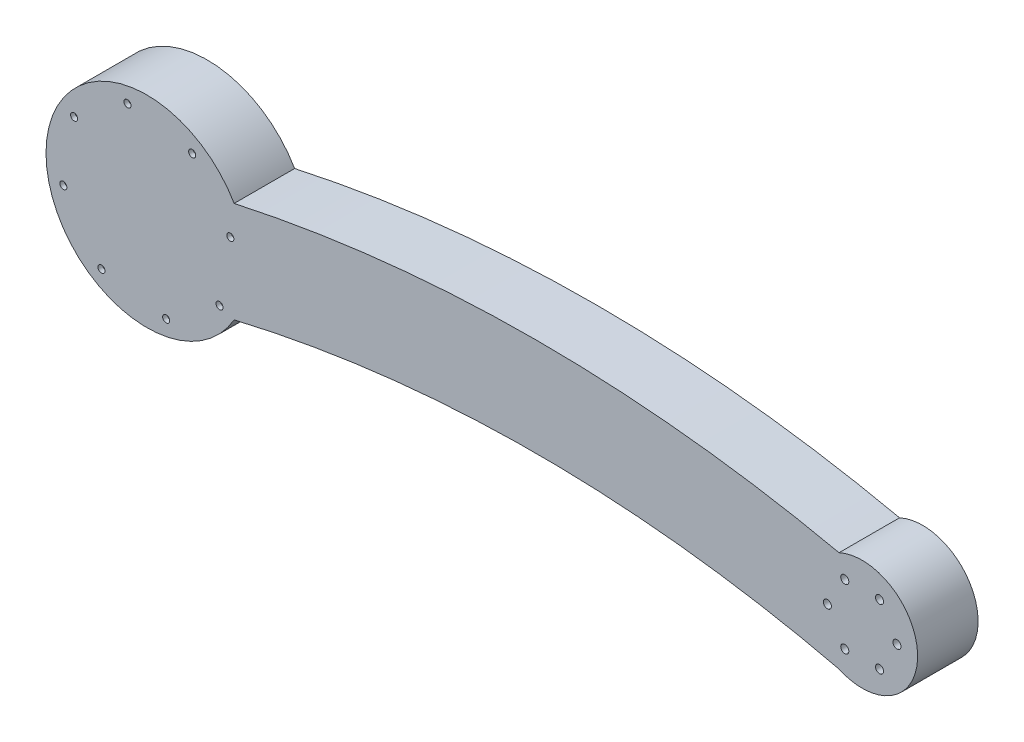
ISO-10303-21;
HEADER;
FILE_DESCRIPTION(('STEP AP214'),'2;1');
FILE_NAME('part.step','',(''),(''),'','','');
FILE_SCHEMA(('AUTOMOTIVE_DESIGN { 1 0 10303 214 1 1 1 1 }'));
ENDSEC;
DATA;
#1=APPLICATION_CONTEXT('core data for automotive mechanical design processes');
#2=APPLICATION_PROTOCOL_DEFINITION('international standard','automotive_design',2000,#1);
#3=PRODUCT_CONTEXT('',#1,'mechanical');
#4=PRODUCT('Part','Part','',(#3));
#5=PRODUCT_RELATED_PRODUCT_CATEGORY('part','',(#4));
#6=PRODUCT_DEFINITION_FORMATION('','',#4);
#7=PRODUCT_DEFINITION_CONTEXT('part definition',#1,'design');
#8=PRODUCT_DEFINITION('design','',#6,#7);
#9=PRODUCT_DEFINITION_SHAPE('','',#8);
#10=(LENGTH_UNIT() NAMED_UNIT(*) SI_UNIT(.MILLI.,.METRE.));
#11=(NAMED_UNIT(*) PLANE_ANGLE_UNIT() SI_UNIT($,.RADIAN.));
#12=(NAMED_UNIT(*) SI_UNIT($,.STERADIAN.) SOLID_ANGLE_UNIT());
#13=UNCERTAINTY_MEASURE_WITH_UNIT(LENGTH_MEASURE(1.E-05),#10,'distance_accuracy_value','');
#14=(GEOMETRIC_REPRESENTATION_CONTEXT(3) GLOBAL_UNCERTAINTY_ASSIGNED_CONTEXT((#13)) GLOBAL_UNIT_ASSIGNED_CONTEXT((#10,
#11,#12)) REPRESENTATION_CONTEXT('',''));
#15=CARTESIAN_POINT('',(0.,0.,0.));
#16=DIRECTION('',(0.,0.,1.));
#17=DIRECTION('',(1.,0.,0.));
#18=AXIS2_PLACEMENT_3D('',#15,#16,#17);
#19=CARTESIAN_POINT('',(161.45643923739,0.,30.));
#20=DIRECTION('',(0.,0.,-1.));
#21=DIRECTION('',(-1.,0.,0.));
#22=AXIS2_PLACEMENT_3D('',#19,#20,#21);
#23=CYLINDRICAL_SURFACE('',#22,27.5);
#24=CARTESIAN_POINT('',(161.45643923739,0.,0.));
#25=DIRECTION('',(0.,0.,1.));
#26=DIRECTION('',(1.,0.,0.));
#27=AXIS2_PLACEMENT_3D('',#24,#25,#26);
#28=CIRCLE('',#27,27.5);
#29=CARTESIAN_POINT('',(150.,-25.,0.));
#30=VERTEX_POINT('',#29);
#31=CARTESIAN_POINT('',(150.,25.,0.));
#32=VERTEX_POINT('',#31);
#33=EDGE_CURVE('E146',#30,#32,#28,.T.);
#34=ORIENTED_EDGE('',*,*,#33,.T.);
#35=DIRECTION('',(0.,0.,-1.));
#36=VECTOR('',#35,1.);
#37=CARTESIAN_POINT('',(150.,25.,30.));
#38=LINE('',#37,#36);
#39=CARTESIAN_POINT('',(150.,25.,30.));
#40=VERTEX_POINT('',#39);
#41=EDGE_CURVE('E11',#40,#32,#38,.T.);
#42=ORIENTED_EDGE('',*,*,#41,.F.);
#43=CARTESIAN_POINT('',(161.45643923739,0.,30.));
#44=DIRECTION('',(0.,0.,1.));
#45=DIRECTION('',(1.,0.,0.));
#46=AXIS2_PLACEMENT_3D('',#43,#44,#45);
#47=CIRCLE('',#46,27.5);
#48=CARTESIAN_POINT('',(150.,-25.,30.));
#49=VERTEX_POINT('',#48);
#50=EDGE_CURVE('E88',#49,#40,#47,.T.);
#51=ORIENTED_EDGE('',*,*,#50,.F.);
#52=DIRECTION('',(0.,0.,-1.));
#53=VECTOR('',#52,1.);
#54=CARTESIAN_POINT('',(150.,-25.,30.));
#55=LINE('',#54,#53);
#56=EDGE_CURVE('E157',#49,#30,#55,.T.);
#57=ORIENTED_EDGE('',*,*,#56,.T.);
#58=EDGE_LOOP('',(#34,#42,#51,#57));
#59=FACE_BOUND('',#58,.T.);
#60=ADVANCED_FACE('F40',(#59),#23,.T.);
#61=CARTESIAN_POINT('',(0.,-658.739716558867,30.));
#62=DIRECTION('',(0.,0.,-1.));
#63=DIRECTION('',(-1.,0.,0.));
#64=AXIS2_PLACEMENT_3D('',#61,#62,#63);
#65=CYLINDRICAL_SURFACE('',#64,700.);
#66=CARTESIAN_POINT('',(0.,-658.739716558867,0.));
#67=DIRECTION('',(0.,0.,1.));
#68=DIRECTION('',(1.,0.,0.));
#69=AXIS2_PLACEMENT_3D('',#66,#67,#68);
#70=CIRCLE('',#69,700.);
#71=CARTESIAN_POINT('',(-150.,25.,0.));
#72=VERTEX_POINT('',#71);
#73=EDGE_CURVE('E160',#72,#32,#70,.F.);
#74=ORIENTED_EDGE('',*,*,#73,.F.);
#75=DIRECTION('',(0.,0.,-1.));
#76=VECTOR('',#75,1.);
#77=CARTESIAN_POINT('',(-150.,25.,30.));
#78=LINE('',#77,#76);
#79=CARTESIAN_POINT('',(-150.,25.,30.));
#80=VERTEX_POINT('',#79);
#81=EDGE_CURVE('E47',#80,#72,#78,.T.);
#82=ORIENTED_EDGE('',*,*,#81,.F.);
#83=CARTESIAN_POINT('',(0.,-658.739716558867,30.));
#84=DIRECTION('',(0.,0.,1.));
#85=DIRECTION('',(1.,0.,0.));
#86=AXIS2_PLACEMENT_3D('',#83,#84,#85);
#87=CIRCLE('',#86,700.);
#88=EDGE_CURVE('E151',#80,#40,#87,.F.);
#89=ORIENTED_EDGE('',*,*,#88,.T.);
#90=ORIENTED_EDGE('',*,*,#41,.T.);
#91=EDGE_LOOP('',(#74,#82,#89,#90));
#92=FACE_BOUND('',#91,.T.);
#93=ADVANCED_FACE('F178',(#92),#65,.T.);
#94=CARTESIAN_POINT('',(-193.301270189222,0.,30.));
#95=DIRECTION('',(0.,0.,-1.));
#96=DIRECTION('',(-1.,0.,0.));
#97=AXIS2_PLACEMENT_3D('',#94,#95,#96);
#98=CYLINDRICAL_SURFACE('',#97,50.);
#99=CARTESIAN_POINT('',(-193.301270189222,0.,0.));
#100=DIRECTION('',(0.,0.,1.));
#101=DIRECTION('',(1.,0.,0.));
#102=AXIS2_PLACEMENT_3D('',#99,#100,#101);
#103=CIRCLE('',#102,50.);
#104=CARTESIAN_POINT('',(-150.,-25.,0.));
#105=VERTEX_POINT('',#104);
#106=EDGE_CURVE('E163',#72,#105,#103,.T.);
#107=ORIENTED_EDGE('',*,*,#106,.T.);
#108=DIRECTION('',(0.,0.,-1.));
#109=VECTOR('',#108,1.);
#110=CARTESIAN_POINT('',(-150.,-25.,30.));
#111=LINE('',#110,#109);
#112=CARTESIAN_POINT('',(-150.,-25.,30.));
#113=VERTEX_POINT('',#112);
#114=EDGE_CURVE('E167',#113,#105,#111,.T.);
#115=ORIENTED_EDGE('',*,*,#114,.F.);
#116=CARTESIAN_POINT('',(-193.301270189222,0.,30.));
#117=DIRECTION('',(0.,0.,1.));
#118=DIRECTION('',(1.,0.,0.));
#119=AXIS2_PLACEMENT_3D('',#116,#117,#118);
#120=CIRCLE('',#119,50.);
#121=EDGE_CURVE('E154',#80,#113,#120,.T.);
#122=ORIENTED_EDGE('',*,*,#121,.F.);
#123=ORIENTED_EDGE('',*,*,#81,.T.);
#124=EDGE_LOOP('',(#107,#115,#122,#123));
#125=FACE_BOUND('',#124,.T.);
#126=ADVANCED_FACE('F171',(#125),#98,.T.);
#127=CARTESIAN_POINT('',(0.,-657.455532033676,30.));
#128=DIRECTION('',(0.,0.,-1.));
#129=DIRECTION('',(-1.,0.,0.));
#130=AXIS2_PLACEMENT_3D('',#127,#128,#129);
#131=CYLINDRICAL_SURFACE('',#130,650.);
#132=CARTESIAN_POINT('',(0.,-657.455532033676,0.));
#133=DIRECTION('',(0.,0.,1.));
#134=DIRECTION('',(1.,0.,0.));
#135=AXIS2_PLACEMENT_3D('',#132,#133,#134);
#136=CIRCLE('',#135,650.);
#137=EDGE_CURVE('E83',#105,#30,#136,.F.);
#138=ORIENTED_EDGE('',*,*,#137,.T.);
#139=ORIENTED_EDGE('',*,*,#56,.F.);
#140=CARTESIAN_POINT('',(0.,-657.455532033676,30.));
#141=DIRECTION('',(0.,0.,1.));
#142=DIRECTION('',(1.,0.,0.));
#143=AXIS2_PLACEMENT_3D('',#140,#141,#142);
#144=CIRCLE('',#143,650.);
#145=EDGE_CURVE('E63',#113,#49,#144,.F.);
#146=ORIENTED_EDGE('',*,*,#145,.F.);
#147=ORIENTED_EDGE('',*,*,#114,.T.);
#148=EDGE_LOOP('',(#138,#139,#146,#147));
#149=FACE_BOUND('',#148,.T.);
#150=ADVANCED_FACE('F180',(#149),#131,.F.);
#151=CARTESIAN_POINT('',(0.,0.,30.));
#152=DIRECTION('',(0.,0.,1.));
#153=DIRECTION('',(1.,0.,0.));
#154=AXIS2_PLACEMENT_3D('',#151,#152,#153);
#155=PLANE('',#154);
#156=CARTESIAN_POINT('',(170.08143923739,-14.9389382152816,30.));
#157=DIRECTION('',(0.,0.,1.));
#158=DIRECTION('',(1.,0.,0.));
#159=AXIS2_PLACEMENT_3D('',#156,#157,#158);
#160=CIRCLE('',#159,2.);
#161=CARTESIAN_POINT('',(172.08143923739,-14.9389382152816,30.));
#162=VERTEX_POINT('',#161);
#163=EDGE_CURVE('E433',#162,#162,#160,.T.);
#164=ORIENTED_EDGE('',*,*,#163,.F.);
#165=EDGE_LOOP('',(#164));
#166=FACE_BOUND('',#165,.T.);
#167=CARTESIAN_POINT('',(178.70643923739,0.,30.));
#168=DIRECTION('',(0.,0.,1.));
#169=DIRECTION('',(1.,0.,0.));
#170=AXIS2_PLACEMENT_3D('',#167,#168,#169);
#171=CIRCLE('',#170,2.);
#172=CARTESIAN_POINT('',(180.70643923739,0.,30.));
#173=VERTEX_POINT('',#172);
#174=EDGE_CURVE('E437',#173,#173,#171,.T.);
#175=ORIENTED_EDGE('',*,*,#174,.F.);
#176=EDGE_LOOP('',(#175));
#177=FACE_BOUND('',#176,.T.);
#178=CARTESIAN_POINT('',(170.08143923739,14.9389382152814,30.));
#179=DIRECTION('',(0.,0.,1.));
#180=DIRECTION('',(1.,0.,0.));
#181=AXIS2_PLACEMENT_3D('',#178,#179,#180);
#182=CIRCLE('',#181,2.);
#183=CARTESIAN_POINT('',(172.08143923739,14.9389382152814,30.));
#184=VERTEX_POINT('',#183);
#185=EDGE_CURVE('E450',#184,#184,#182,.T.);
#186=ORIENTED_EDGE('',*,*,#185,.F.);
#187=EDGE_LOOP('',(#186));
#188=FACE_BOUND('',#187,.T.);
#189=CARTESIAN_POINT('',(144.20643923739,1.24681137647146E-13,30.));
#190=DIRECTION('',(0.,0.,1.));
#191=DIRECTION('',(1.,0.,0.));
#192=AXIS2_PLACEMENT_3D('',#189,#190,#191);
#193=CIRCLE('',#192,2.);
#194=CARTESIAN_POINT('',(146.20643923739,1.24681137647146E-13,30.));
#195=VERTEX_POINT('',#194);
#196=EDGE_CURVE('E443',#195,#195,#193,.T.);
#197=ORIENTED_EDGE('',*,*,#196,.F.);
#198=EDGE_LOOP('',(#197));
#199=FACE_BOUND('',#198,.T.);
#200=CARTESIAN_POINT('',(152.83143923739,-14.9389382152815,30.));
#201=DIRECTION('',(0.,0.,1.));
#202=DIRECTION('',(1.,0.,0.));
#203=AXIS2_PLACEMENT_3D('',#200,#201,#202);
#204=CIRCLE('',#203,2.);
#205=CARTESIAN_POINT('',(154.83143923739,-14.9389382152815,30.));
#206=VERTEX_POINT('',#205);
#207=EDGE_CURVE('E439',#206,#206,#204,.T.);
#208=ORIENTED_EDGE('',*,*,#207,.F.);
#209=EDGE_LOOP('',(#208));
#210=FACE_BOUND('',#209,.T.);
#211=CARTESIAN_POINT('',(152.83143923739,14.9389382152816,30.));
#212=DIRECTION('',(0.,0.,1.));
#213=DIRECTION('',(1.,0.,0.));
#214=AXIS2_PLACEMENT_3D('',#211,#212,#213);
#215=CIRCLE('',#214,2.);
#216=CARTESIAN_POINT('',(154.83143923739,14.9389382152816,30.));
#217=VERTEX_POINT('',#216);
#218=EDGE_CURVE('E446',#217,#217,#215,.T.);
#219=ORIENTED_EDGE('',*,*,#218,.F.);
#220=EDGE_LOOP('',(#219));
#221=FACE_BOUND('',#220,.T.);
#222=CARTESIAN_POINT('',(-151.896300525084,9.58532665650083,30.));
#223=DIRECTION('',(0.,0.,-1.));
#224=DIRECTION('',(-1.,0.,0.));
#225=AXIS2_PLACEMENT_3D('',#222,#223,#224);
#226=CIRCLE('',#225,1.75000000000001);
#227=CARTESIAN_POINT('',(-153.646300525084,9.58532665650083,30.));
#228=VERTEX_POINT('',#227);
#229=EDGE_CURVE('E142',#228,#228,#226,.T.);
#230=ORIENTED_EDGE('',*,*,#229,.T.);
#231=EDGE_LOOP('',(#230));
#232=FACE_BOUND('',#231,.T.);
#233=CARTESIAN_POINT('',(-157.245685886187,-22.4998853456347,30.));
#234=DIRECTION('',(0.,0.,-1.));
#235=DIRECTION('',(-1.,0.,0.));
#236=AXIS2_PLACEMENT_3D('',#233,#234,#235);
#237=CIRCLE('',#236,1.75);
#238=CARTESIAN_POINT('',(-158.995685886187,-22.4998853456347,30.));
#239=VERTEX_POINT('',#238);
#240=EDGE_CURVE('E470',#239,#239,#237,.T.);
#241=ORIENTED_EDGE('',*,*,#240,.T.);
#242=EDGE_LOOP('',(#241));
#243=FACE_BOUND('',#242,.T.);
#244=CARTESIAN_POINT('',(-183.715943532721,-41.4049696641373,30.));
#245=DIRECTION('',(0.,0.,-1.));
#246=DIRECTION('',(-1.,0.,0.));
#247=AXIS2_PLACEMENT_3D('',#244,#245,#246);
#248=CIRCLE('',#247,1.75);
#249=CARTESIAN_POINT('',(-185.465943532721,-41.4049696641373,30.));
#250=VERTEX_POINT('',#249);
#251=EDGE_CURVE('E476',#250,#250,#248,.T.);
#252=ORIENTED_EDGE('',*,*,#251,.T.);
#253=EDGE_LOOP('',(#252));
#254=FACE_BOUND('',#253,.T.);
#255=CARTESIAN_POINT('',(-215.801155534857,-36.0555843030344,30.));
#256=DIRECTION('',(0.,0.,-1.));
#257=DIRECTION('',(-1.,0.,0.));
#258=AXIS2_PLACEMENT_3D('',#255,#256,#257);
#259=CIRCLE('',#258,1.75000000000002);
#260=CARTESIAN_POINT('',(-217.551155534858,-36.0555843030344,30.));
#261=VERTEX_POINT('',#260);
#262=EDGE_CURVE('E482',#261,#261,#259,.T.);
#263=ORIENTED_EDGE('',*,*,#262,.T.);
#264=EDGE_LOOP('',(#263));
#265=FACE_BOUND('',#264,.T.);
#266=CARTESIAN_POINT('',(-234.70623985336,-9.58532665649994,30.));
#267=DIRECTION('',(0.,0.,-1.));
#268=DIRECTION('',(-1.,0.,0.));
#269=AXIS2_PLACEMENT_3D('',#266,#267,#268);
#270=CIRCLE('',#269,1.75000000000003);
#271=CARTESIAN_POINT('',(-236.45623985336,-9.58532665649994,30.));
#272=VERTEX_POINT('',#271);
#273=EDGE_CURVE('E488',#272,#272,#270,.T.);
#274=ORIENTED_EDGE('',*,*,#273,.T.);
#275=EDGE_LOOP('',(#274));
#276=FACE_BOUND('',#275,.T.);
#277=CARTESIAN_POINT('',(-229.356854492257,22.4998853456361,30.));
#278=DIRECTION('',(0.,0.,-1.));
#279=DIRECTION('',(-1.,0.,0.));
#280=AXIS2_PLACEMENT_3D('',#277,#278,#279);
#281=CIRCLE('',#280,1.75000000000001);
#282=CARTESIAN_POINT('',(-231.106854492257,22.4998853456361,30.));
#283=VERTEX_POINT('',#282);
#284=EDGE_CURVE('E494',#283,#283,#281,.T.);
#285=ORIENTED_EDGE('',*,*,#284,.T.);
#286=EDGE_LOOP('',(#285));
#287=FACE_BOUND('',#286,.T.);
#288=CARTESIAN_POINT('',(-202.886596845722,41.4049696641386,30.));
#289=DIRECTION('',(0.,0.,-1.));
#290=DIRECTION('',(-1.,0.,0.));
#291=AXIS2_PLACEMENT_3D('',#288,#289,#290);
#292=CIRCLE('',#291,1.75000000000001);
#293=CARTESIAN_POINT('',(-204.636596845722,41.4049696641386,30.));
#294=VERTEX_POINT('',#293);
#295=EDGE_CURVE('E500',#294,#294,#292,.T.);
#296=ORIENTED_EDGE('',*,*,#295,.T.);
#297=EDGE_LOOP('',(#296));
#298=FACE_BOUND('',#297,.T.);
#299=CARTESIAN_POINT('',(-170.801384843586,36.0555843030354,30.));
#300=DIRECTION('',(0.,0.,-1.));
#301=DIRECTION('',(-1.,0.,0.));
#302=AXIS2_PLACEMENT_3D('',#299,#300,#301);
#303=CIRCLE('',#302,1.75000000000001);
#304=CARTESIAN_POINT('',(-172.551384843586,36.0555843030354,30.));
#305=VERTEX_POINT('',#304);
#306=EDGE_CURVE('E459',#305,#305,#303,.T.);
#307=ORIENTED_EDGE('',*,*,#306,.T.);
#308=EDGE_LOOP('',(#307));
#309=FACE_BOUND('',#308,.T.);
#310=ORIENTED_EDGE('',*,*,#50,.T.);
#311=ORIENTED_EDGE('',*,*,#88,.F.);
#312=ORIENTED_EDGE('',*,*,#121,.T.);
#313=ORIENTED_EDGE('',*,*,#145,.T.);
#314=EDGE_LOOP('',(#310,#311,#312,#313));
#315=FACE_BOUND('',#314,.T.);
#316=ADVANCED_FACE('F182',(#166,#177,#188,#199,#210,#221,#232,#243,#254,#265,#276,#287,#298,
#309,#315),#155,.T.);
#317=CARTESIAN_POINT('',(0.,0.,0.));
#318=DIRECTION('',(0.,0.,1.));
#319=DIRECTION('',(1.,0.,0.));
#320=AXIS2_PLACEMENT_3D('',#317,#318,#319);
#321=PLANE('',#320);
#322=CARTESIAN_POINT('',(170.08143923739,-14.9389382152816,0.));
#323=DIRECTION('',(0.,0.,1.));
#324=DIRECTION('',(1.,0.,0.));
#325=AXIS2_PLACEMENT_3D('',#322,#323,#324);
#326=CIRCLE('',#325,2.);
#327=CARTESIAN_POINT('',(172.08143923739,-14.9389382152816,0.));
#328=VERTEX_POINT('',#327);
#329=EDGE_CURVE('E430',#328,#328,#326,.T.);
#330=ORIENTED_EDGE('',*,*,#329,.T.);
#331=EDGE_LOOP('',(#330));
#332=FACE_BOUND('',#331,.T.);
#333=CARTESIAN_POINT('',(178.70643923739,0.,0.));
#334=DIRECTION('',(0.,0.,1.));
#335=DIRECTION('',(1.,0.,0.));
#336=AXIS2_PLACEMENT_3D('',#333,#334,#335);
#337=CIRCLE('',#336,2.);
#338=CARTESIAN_POINT('',(180.70643923739,0.,0.));
#339=VERTEX_POINT('',#338);
#340=EDGE_CURVE('E434',#339,#339,#337,.T.);
#341=ORIENTED_EDGE('',*,*,#340,.T.);
#342=EDGE_LOOP('',(#341));
#343=FACE_BOUND('',#342,.T.);
#344=CARTESIAN_POINT('',(170.08143923739,14.9389382152814,0.));
#345=DIRECTION('',(0.,0.,1.));
#346=DIRECTION('',(1.,0.,0.));
#347=AXIS2_PLACEMENT_3D('',#344,#345,#346);
#348=CIRCLE('',#347,2.);
#349=CARTESIAN_POINT('',(172.08143923739,14.9389382152814,0.));
#350=VERTEX_POINT('',#349);
#351=EDGE_CURVE('E453',#350,#350,#348,.T.);
#352=ORIENTED_EDGE('',*,*,#351,.T.);
#353=EDGE_LOOP('',(#352));
#354=FACE_BOUND('',#353,.T.);
#355=CARTESIAN_POINT('',(144.20643923739,1.24681137647146E-13,0.));
#356=DIRECTION('',(0.,0.,1.));
#357=DIRECTION('',(1.,0.,0.));
#358=AXIS2_PLACEMENT_3D('',#355,#356,#357);
#359=CIRCLE('',#358,2.);
#360=CARTESIAN_POINT('',(146.20643923739,1.24681137647146E-13,0.));
#361=VERTEX_POINT('',#360);
#362=EDGE_CURVE('E447',#361,#361,#359,.T.);
#363=ORIENTED_EDGE('',*,*,#362,.T.);
#364=EDGE_LOOP('',(#363));
#365=FACE_BOUND('',#364,.T.);
#366=CARTESIAN_POINT('',(152.83143923739,-14.9389382152815,0.));
#367=DIRECTION('',(0.,0.,1.));
#368=DIRECTION('',(1.,0.,0.));
#369=AXIS2_PLACEMENT_3D('',#366,#367,#368);
#370=CIRCLE('',#369,2.);
#371=CARTESIAN_POINT('',(154.83143923739,-14.9389382152815,0.));
#372=VERTEX_POINT('',#371);
#373=EDGE_CURVE('E560',#372,#372,#370,.T.);
#374=ORIENTED_EDGE('',*,*,#373,.T.);
#375=EDGE_LOOP('',(#374));
#376=FACE_BOUND('',#375,.T.);
#377=CARTESIAN_POINT('',(152.83143923739,14.9389382152816,0.));
#378=DIRECTION('',(0.,0.,1.));
#379=DIRECTION('',(1.,0.,0.));
#380=AXIS2_PLACEMENT_3D('',#377,#378,#379);
#381=CIRCLE('',#380,2.);
#382=CARTESIAN_POINT('',(154.83143923739,14.9389382152816,0.));
#383=VERTEX_POINT('',#382);
#384=EDGE_CURVE('E456',#383,#383,#381,.T.);
#385=ORIENTED_EDGE('',*,*,#384,.T.);
#386=EDGE_LOOP('',(#385));
#387=FACE_BOUND('',#386,.T.);
#388=DIRECTION('',(0.225537097800018,-0.974234580332655,0.));
#389=VECTOR('',#388,1.);
#390=CARTESIAN_POINT('',(-228.526967204746,-52.9044133650023,0.));
#391=LINE('',#390,#389);
#392=CARTESIAN_POINT('',(-241.460241997675,2.9624203538032,0.));
#393=VERTEX_POINT('',#392);
#394=CARTESIAN_POINT('',(-235.258997061539,-23.8246019003048,0.));
#395=VERTEX_POINT('',#394);
#396=EDGE_CURVE('E141',#393,#395,#391,.T.);
#397=ORIENTED_EDGE('',*,*,#396,.T.);
#398=CARTESIAN_POINT('',(-193.301270189222,0.,0.));
#399=DIRECTION('',(0.,0.,-1.));
#400=DIRECTION('',(-1.,0.,0.));
#401=AXIS2_PLACEMENT_3D('',#398,#399,#400);
#402=CIRCLE('',#401,48.25);
#403=CARTESIAN_POINT('',(-145.115292458583,-2.48476359889796,0.));
#404=VERTEX_POINT('',#403);
#405=EDGE_CURVE('E54',#404,#395,#402,.T.);
#406=ORIENTED_EDGE('',*,*,#405,.F.);
#407=DIRECTION('',(0.225537097800018,-0.974234580332655,0.));
#408=VECTOR('',#407,1.);
#409=CARTESIAN_POINT('',(-138.27968268441,-32.012000956382,0.));
#410=LINE('',#409,#408);
#411=CARTESIAN_POINT('',(-151.109377559959,23.4074068696373,0.));
#412=VERTEX_POINT('',#411);
#413=EDGE_CURVE('E132',#412,#404,#410,.T.);
#414=ORIENTED_EDGE('',*,*,#413,.F.);
#415=EDGE_CURVE('E135',#393,#412,#402,.T.);
#416=ORIENTED_EDGE('',*,*,#415,.F.);
#417=EDGE_LOOP('',(#397,#406,#414,#416));
#418=FACE_BOUND('',#417,.T.);
#419=ORIENTED_EDGE('',*,*,#33,.F.);
#420=ORIENTED_EDGE('',*,*,#137,.F.);
#421=ORIENTED_EDGE('',*,*,#106,.F.);
#422=ORIENTED_EDGE('',*,*,#73,.T.);
#423=EDGE_LOOP('',(#419,#420,#421,#422));
#424=FACE_BOUND('',#423,.T.);
#425=ADVANCED_FACE('F177',(#332,#343,#354,#365,#376,#387,#418,#424),#321,.F.);
#426=CARTESIAN_POINT('',(-193.301270189222,0.,27.75));
#427=DIRECTION('',(0.,0.,-1.));
#428=DIRECTION('',(-1.,0.,0.));
#429=AXIS2_PLACEMENT_3D('',#426,#427,#428);
#430=CYLINDRICAL_SURFACE('',#429,48.25);
#431=ORIENTED_EDGE('',*,*,#405,.T.);
#432=DIRECTION('',(0.,0.,-1.));
#433=VECTOR('',#432,1.);
#434=CARTESIAN_POINT('',(-235.258997061539,-23.8246019003048,27.75));
#435=LINE('',#434,#433);
#436=CARTESIAN_POINT('',(-235.258997061539,-23.8246019003048,27.75));
#437=VERTEX_POINT('',#436);
#438=EDGE_CURVE('E115',#437,#395,#435,.T.);
#439=ORIENTED_EDGE('',*,*,#438,.F.);
#440=CARTESIAN_POINT('',(-193.301270189222,0.,27.75));
#441=DIRECTION('',(0.,0.,-1.));
#442=DIRECTION('',(-1.,0.,0.));
#443=AXIS2_PLACEMENT_3D('',#440,#441,#442);
#444=CIRCLE('',#443,48.25);
#445=CARTESIAN_POINT('',(-145.115292458583,-2.48476359889796,27.75));
#446=VERTEX_POINT('',#445);
#447=EDGE_CURVE('E123',#446,#437,#444,.T.);
#448=ORIENTED_EDGE('',*,*,#447,.F.);
#449=DIRECTION('',(0.,0.,-1.));
#450=VECTOR('',#449,1.);
#451=CARTESIAN_POINT('',(-145.115292458583,-2.48476359889796,27.75));
#452=LINE('',#451,#450);
#453=EDGE_CURVE('E144',#446,#404,#452,.T.);
#454=ORIENTED_EDGE('',*,*,#453,.T.);
#455=EDGE_LOOP('',(#431,#439,#448,#454));
#456=FACE_BOUND('',#455,.T.);
#457=ADVANCED_FACE('F126',(#456),#430,.F.);
#458=CARTESIAN_POINT('',(-138.27968268441,-32.012000956382,27.75));
#459=DIRECTION('',(0.974234580332655,0.225537097800018,0.));
#460=DIRECTION('',(-0.225537097800018,0.974234580332655,0.));
#461=AXIS2_PLACEMENT_3D('',#458,#459,#460);
#462=PLANE('',#461);
#463=ORIENTED_EDGE('',*,*,#413,.T.);
#464=ORIENTED_EDGE('',*,*,#453,.F.);
#465=DIRECTION('',(0.225537097800018,-0.974234580332655,0.));
#466=VECTOR('',#465,1.);
#467=CARTESIAN_POINT('',(-138.27968268441,-32.012000956382,27.75));
#468=LINE('',#467,#466);
#469=CARTESIAN_POINT('',(-151.109377559959,23.4074068696373,27.75));
#470=VERTEX_POINT('',#469);
#471=EDGE_CURVE('E128',#470,#446,#468,.T.);
#472=ORIENTED_EDGE('',*,*,#471,.F.);
#473=DIRECTION('',(0.,0.,-1.));
#474=VECTOR('',#473,1.);
#475=CARTESIAN_POINT('',(-151.109377559959,23.4074068696373,27.75));
#476=LINE('',#475,#474);
#477=EDGE_CURVE('E147',#470,#412,#476,.T.);
#478=ORIENTED_EDGE('',*,*,#477,.T.);
#479=EDGE_LOOP('',(#463,#464,#472,#478));
#480=FACE_BOUND('',#479,.T.);
#481=ADVANCED_FACE('F251',(#480),#462,.F.);
#482=ORIENTED_EDGE('',*,*,#415,.T.);
#483=ORIENTED_EDGE('',*,*,#477,.F.);
#484=CARTESIAN_POINT('',(-241.460241997675,2.9624203538032,27.75));
#485=VERTEX_POINT('',#484);
#486=EDGE_CURVE('E122',#485,#470,#444,.T.);
#487=ORIENTED_EDGE('',*,*,#486,.F.);
#488=DIRECTION('',(0.,0.,-1.));
#489=VECTOR('',#488,1.);
#490=CARTESIAN_POINT('',(-241.460241997675,2.9624203538032,27.75));
#491=LINE('',#490,#489);
#492=EDGE_CURVE('E117',#485,#393,#491,.T.);
#493=ORIENTED_EDGE('',*,*,#492,.T.);
#494=EDGE_LOOP('',(#482,#483,#487,#493));
#495=FACE_BOUND('',#494,.T.);
#496=ADVANCED_FACE('F253',(#495),#430,.F.);
#497=CARTESIAN_POINT('',(-228.526967204746,-52.9044133650023,27.75));
#498=DIRECTION('',(0.974234580332655,0.225537097800018,0.));
#499=DIRECTION('',(-0.225537097800018,0.974234580332655,0.));
#500=AXIS2_PLACEMENT_3D('',#497,#498,#499);
#501=PLANE('',#500);
#502=ORIENTED_EDGE('',*,*,#396,.F.);
#503=ORIENTED_EDGE('',*,*,#492,.F.);
#504=DIRECTION('',(0.225537097800018,-0.974234580332655,0.));
#505=VECTOR('',#504,1.);
#506=CARTESIAN_POINT('',(-228.526967204746,-52.9044133650023,27.75));
#507=LINE('',#506,#505);
#508=EDGE_CURVE('E112',#485,#437,#507,.T.);
#509=ORIENTED_EDGE('',*,*,#508,.T.);
#510=ORIENTED_EDGE('',*,*,#438,.T.);
#511=EDGE_LOOP('',(#502,#503,#509,#510));
#512=FACE_BOUND('',#511,.T.);
#513=ADVANCED_FACE('F114',(#512),#501,.T.);
#514=CARTESIAN_POINT('',(0.,0.,27.75));
#515=DIRECTION('',(0.,0.,-1.));
#516=DIRECTION('',(-1.,0.,0.));
#517=AXIS2_PLACEMENT_3D('',#514,#515,#516);
#518=PLANE('',#517);
#519=CARTESIAN_POINT('',(-151.896300525084,9.58532665650083,27.75));
#520=DIRECTION('',(0.,0.,-1.));
#521=DIRECTION('',(-1.,0.,0.));
#522=AXIS2_PLACEMENT_3D('',#519,#520,#521);
#523=CIRCLE('',#522,1.75000000000001);
#524=CARTESIAN_POINT('',(-153.646300525084,9.58532665650083,27.75));
#525=VERTEX_POINT('',#524);
#526=EDGE_CURVE('E464',#525,#525,#523,.T.);
#527=ORIENTED_EDGE('',*,*,#526,.F.);
#528=EDGE_LOOP('',(#527));
#529=FACE_BOUND('',#528,.T.);
#530=CARTESIAN_POINT('',(-157.245685886187,-22.4998853456347,27.75));
#531=DIRECTION('',(0.,0.,-1.));
#532=DIRECTION('',(-1.,0.,0.));
#533=AXIS2_PLACEMENT_3D('',#530,#531,#532);
#534=CIRCLE('',#533,1.75);
#535=CARTESIAN_POINT('',(-158.995685886187,-22.4998853456347,27.75));
#536=VERTEX_POINT('',#535);
#537=EDGE_CURVE('E467',#536,#536,#534,.T.);
#538=ORIENTED_EDGE('',*,*,#537,.F.);
#539=EDGE_LOOP('',(#538));
#540=FACE_BOUND('',#539,.T.);
#541=CARTESIAN_POINT('',(-183.715943532721,-41.4049696641373,27.75));
#542=DIRECTION('',(0.,0.,-1.));
#543=DIRECTION('',(-1.,0.,0.));
#544=AXIS2_PLACEMENT_3D('',#541,#542,#543);
#545=CIRCLE('',#544,1.75);
#546=CARTESIAN_POINT('',(-185.465943532721,-41.4049696641373,27.75));
#547=VERTEX_POINT('',#546);
#548=EDGE_CURVE('E473',#547,#547,#545,.T.);
#549=ORIENTED_EDGE('',*,*,#548,.F.);
#550=EDGE_LOOP('',(#549));
#551=FACE_BOUND('',#550,.T.);
#552=CARTESIAN_POINT('',(-215.801155534857,-36.0555843030344,27.75));
#553=DIRECTION('',(0.,0.,-1.));
#554=DIRECTION('',(-1.,0.,0.));
#555=AXIS2_PLACEMENT_3D('',#552,#553,#554);
#556=CIRCLE('',#555,1.75000000000002);
#557=CARTESIAN_POINT('',(-217.551155534858,-36.0555843030344,27.75));
#558=VERTEX_POINT('',#557);
#559=EDGE_CURVE('E479',#558,#558,#556,.T.);
#560=ORIENTED_EDGE('',*,*,#559,.F.);
#561=EDGE_LOOP('',(#560));
#562=FACE_BOUND('',#561,.T.);
#563=CARTESIAN_POINT('',(-234.70623985336,-9.58532665649994,27.75));
#564=DIRECTION('',(0.,0.,-1.));
#565=DIRECTION('',(-1.,0.,0.));
#566=AXIS2_PLACEMENT_3D('',#563,#564,#565);
#567=CIRCLE('',#566,1.75000000000003);
#568=CARTESIAN_POINT('',(-236.45623985336,-9.58532665649994,27.75));
#569=VERTEX_POINT('',#568);
#570=EDGE_CURVE('E485',#569,#569,#567,.T.);
#571=ORIENTED_EDGE('',*,*,#570,.F.);
#572=EDGE_LOOP('',(#571));
#573=FACE_BOUND('',#572,.T.);
#574=CARTESIAN_POINT('',(-229.356854492257,22.4998853456361,27.75));
#575=DIRECTION('',(0.,0.,-1.));
#576=DIRECTION('',(-1.,0.,0.));
#577=AXIS2_PLACEMENT_3D('',#574,#575,#576);
#578=CIRCLE('',#577,1.75000000000001);
#579=CARTESIAN_POINT('',(-231.106854492257,22.4998853456361,27.75));
#580=VERTEX_POINT('',#579);
#581=EDGE_CURVE('E491',#580,#580,#578,.T.);
#582=ORIENTED_EDGE('',*,*,#581,.F.);
#583=EDGE_LOOP('',(#582));
#584=FACE_BOUND('',#583,.T.);
#585=CARTESIAN_POINT('',(-202.886596845722,41.4049696641386,27.75));
#586=DIRECTION('',(0.,0.,-1.));
#587=DIRECTION('',(-1.,0.,0.));
#588=AXIS2_PLACEMENT_3D('',#585,#586,#587);
#589=CIRCLE('',#588,1.75000000000001);
#590=CARTESIAN_POINT('',(-204.636596845722,41.4049696641386,27.75));
#591=VERTEX_POINT('',#590);
#592=EDGE_CURVE('E497',#591,#591,#589,.T.);
#593=ORIENTED_EDGE('',*,*,#592,.F.);
#594=EDGE_LOOP('',(#593));
#595=FACE_BOUND('',#594,.T.);
#596=CARTESIAN_POINT('',(-170.801384843586,36.0555843030354,27.75));
#597=DIRECTION('',(0.,0.,-1.));
#598=DIRECTION('',(-1.,0.,0.));
#599=AXIS2_PLACEMENT_3D('',#596,#597,#598);
#600=CIRCLE('',#599,1.75000000000001);
#601=CARTESIAN_POINT('',(-172.551384843586,36.0555843030354,27.75));
#602=VERTEX_POINT('',#601);
#603=EDGE_CURVE('E503',#602,#602,#600,.T.);
#604=ORIENTED_EDGE('',*,*,#603,.F.);
#605=EDGE_LOOP('',(#604));
#606=FACE_BOUND('',#605,.T.);
#607=ORIENTED_EDGE('',*,*,#447,.T.);
#608=ORIENTED_EDGE('',*,*,#508,.F.);
#609=ORIENTED_EDGE('',*,*,#486,.T.);
#610=ORIENTED_EDGE('',*,*,#471,.T.);
#611=EDGE_LOOP('',(#607,#608,#609,#610));
#612=FACE_BOUND('',#611,.T.);
#613=ADVANCED_FACE('F130',(#529,#540,#551,#562,#573,#584,#595,#606,#612),#518,.T.);
#614=CARTESIAN_POINT('',(-170.801384843586,36.0555843030354,30.));
#615=DIRECTION('',(0.,0.,-1.));
#616=DIRECTION('',(-1.,0.,0.));
#617=AXIS2_PLACEMENT_3D('',#614,#615,#616);
#618=CYLINDRICAL_SURFACE('',#617,1.75000000000001);
#619=ORIENTED_EDGE('',*,*,#306,.F.);
#620=EDGE_LOOP('',(#619));
#621=FACE_BOUND('',#620,.T.);
#622=ORIENTED_EDGE('',*,*,#603,.T.);
#623=EDGE_LOOP('',(#622));
#624=FACE_BOUND('',#623,.T.);
#625=ADVANCED_FACE('F286',(#621,#624),#618,.F.);
#626=CARTESIAN_POINT('',(-202.886596845722,41.4049696641386,30.));
#627=DIRECTION('',(0.,0.,-1.));
#628=DIRECTION('',(-1.,0.,0.));
#629=AXIS2_PLACEMENT_3D('',#626,#627,#628);
#630=CYLINDRICAL_SURFACE('',#629,1.75000000000001);
#631=ORIENTED_EDGE('',*,*,#295,.F.);
#632=EDGE_LOOP('',(#631));
#633=FACE_BOUND('',#632,.T.);
#634=ORIENTED_EDGE('',*,*,#592,.T.);
#635=EDGE_LOOP('',(#634));
#636=FACE_BOUND('',#635,.T.);
#637=ADVANCED_FACE('F296',(#633,#636),#630,.F.);
#638=CARTESIAN_POINT('',(-229.356854492257,22.4998853456361,30.));
#639=DIRECTION('',(0.,0.,-1.));
#640=DIRECTION('',(-1.,0.,0.));
#641=AXIS2_PLACEMENT_3D('',#638,#639,#640);
#642=CYLINDRICAL_SURFACE('',#641,1.75000000000001);
#643=ORIENTED_EDGE('',*,*,#284,.F.);
#644=EDGE_LOOP('',(#643));
#645=FACE_BOUND('',#644,.T.);
#646=ORIENTED_EDGE('',*,*,#581,.T.);
#647=EDGE_LOOP('',(#646));
#648=FACE_BOUND('',#647,.T.);
#649=ADVANCED_FACE('F306',(#645,#648),#642,.F.);
#650=CARTESIAN_POINT('',(-234.70623985336,-9.58532665649994,30.));
#651=DIRECTION('',(0.,0.,-1.));
#652=DIRECTION('',(-1.,0.,0.));
#653=AXIS2_PLACEMENT_3D('',#650,#651,#652);
#654=CYLINDRICAL_SURFACE('',#653,1.75000000000003);
#655=ORIENTED_EDGE('',*,*,#273,.F.);
#656=EDGE_LOOP('',(#655));
#657=FACE_BOUND('',#656,.T.);
#658=ORIENTED_EDGE('',*,*,#570,.T.);
#659=EDGE_LOOP('',(#658));
#660=FACE_BOUND('',#659,.T.);
#661=ADVANCED_FACE('F316',(#657,#660),#654,.F.);
#662=CARTESIAN_POINT('',(-215.801155534857,-36.0555843030344,30.));
#663=DIRECTION('',(0.,0.,-1.));
#664=DIRECTION('',(-1.,0.,0.));
#665=AXIS2_PLACEMENT_3D('',#662,#663,#664);
#666=CYLINDRICAL_SURFACE('',#665,1.75000000000002);
#667=ORIENTED_EDGE('',*,*,#262,.F.);
#668=EDGE_LOOP('',(#667));
#669=FACE_BOUND('',#668,.T.);
#670=ORIENTED_EDGE('',*,*,#559,.T.);
#671=EDGE_LOOP('',(#670));
#672=FACE_BOUND('',#671,.T.);
#673=ADVANCED_FACE('F326',(#669,#672),#666,.F.);
#674=CARTESIAN_POINT('',(-183.715943532721,-41.4049696641373,30.));
#675=DIRECTION('',(0.,0.,-1.));
#676=DIRECTION('',(-1.,0.,0.));
#677=AXIS2_PLACEMENT_3D('',#674,#675,#676);
#678=CYLINDRICAL_SURFACE('',#677,1.75);
#679=ORIENTED_EDGE('',*,*,#251,.F.);
#680=EDGE_LOOP('',(#679));
#681=FACE_BOUND('',#680,.T.);
#682=ORIENTED_EDGE('',*,*,#548,.T.);
#683=EDGE_LOOP('',(#682));
#684=FACE_BOUND('',#683,.T.);
#685=ADVANCED_FACE('F336',(#681,#684),#678,.F.);
#686=CARTESIAN_POINT('',(-157.245685886187,-22.4998853456347,30.));
#687=DIRECTION('',(0.,0.,-1.));
#688=DIRECTION('',(-1.,0.,0.));
#689=AXIS2_PLACEMENT_3D('',#686,#687,#688);
#690=CYLINDRICAL_SURFACE('',#689,1.75);
#691=ORIENTED_EDGE('',*,*,#240,.F.);
#692=EDGE_LOOP('',(#691));
#693=FACE_BOUND('',#692,.T.);
#694=ORIENTED_EDGE('',*,*,#537,.T.);
#695=EDGE_LOOP('',(#694));
#696=FACE_BOUND('',#695,.T.);
#697=ADVANCED_FACE('F346',(#693,#696),#690,.F.);
#698=CARTESIAN_POINT('',(-151.896300525084,9.58532665650083,30.));
#699=DIRECTION('',(0.,0.,-1.));
#700=DIRECTION('',(-1.,0.,0.));
#701=AXIS2_PLACEMENT_3D('',#698,#699,#700);
#702=CYLINDRICAL_SURFACE('',#701,1.75000000000001);
#703=ORIENTED_EDGE('',*,*,#229,.F.);
#704=EDGE_LOOP('',(#703));
#705=FACE_BOUND('',#704,.T.);
#706=ORIENTED_EDGE('',*,*,#526,.T.);
#707=EDGE_LOOP('',(#706));
#708=FACE_BOUND('',#707,.T.);
#709=ADVANCED_FACE('F356',(#705,#708),#702,.F.);
#710=CARTESIAN_POINT('',(152.83143923739,14.9389382152816,0.));
#711=DIRECTION('',(0.,0.,1.));
#712=DIRECTION('',(1.,0.,0.));
#713=AXIS2_PLACEMENT_3D('',#710,#711,#712);
#714=CYLINDRICAL_SURFACE('',#713,2.);
#715=ORIENTED_EDGE('',*,*,#384,.F.);
#716=EDGE_LOOP('',(#715));
#717=FACE_BOUND('',#716,.T.);
#718=ORIENTED_EDGE('',*,*,#218,.T.);
#719=EDGE_LOOP('',(#718));
#720=FACE_BOUND('',#719,.T.);
#721=ADVANCED_FACE('F365',(#717,#720),#714,.F.);
#722=CARTESIAN_POINT('',(152.83143923739,-14.9389382152815,0.));
#723=DIRECTION('',(0.,0.,1.));
#724=DIRECTION('',(1.,0.,0.));
#725=AXIS2_PLACEMENT_3D('',#722,#723,#724);
#726=CYLINDRICAL_SURFACE('',#725,2.);
#727=ORIENTED_EDGE('',*,*,#373,.F.);
#728=EDGE_LOOP('',(#727));
#729=FACE_BOUND('',#728,.T.);
#730=ORIENTED_EDGE('',*,*,#207,.T.);
#731=EDGE_LOOP('',(#730));
#732=FACE_BOUND('',#731,.T.);
#733=ADVANCED_FACE('F374',(#729,#732),#726,.F.);
#734=CARTESIAN_POINT('',(144.20643923739,1.24681137647146E-13,0.));
#735=DIRECTION('',(0.,0.,1.));
#736=DIRECTION('',(1.,0.,0.));
#737=AXIS2_PLACEMENT_3D('',#734,#735,#736);
#738=CYLINDRICAL_SURFACE('',#737,2.);
#739=ORIENTED_EDGE('',*,*,#362,.F.);
#740=EDGE_LOOP('',(#739));
#741=FACE_BOUND('',#740,.T.);
#742=ORIENTED_EDGE('',*,*,#196,.T.);
#743=EDGE_LOOP('',(#742));
#744=FACE_BOUND('',#743,.T.);
#745=ADVANCED_FACE('F384',(#741,#744),#738,.F.);
#746=CARTESIAN_POINT('',(170.08143923739,14.9389382152814,0.));
#747=DIRECTION('',(0.,0.,1.));
#748=DIRECTION('',(1.,0.,0.));
#749=AXIS2_PLACEMENT_3D('',#746,#747,#748);
#750=CYLINDRICAL_SURFACE('',#749,2.);
#751=ORIENTED_EDGE('',*,*,#351,.F.);
#752=EDGE_LOOP('',(#751));
#753=FACE_BOUND('',#752,.T.);
#754=ORIENTED_EDGE('',*,*,#185,.T.);
#755=EDGE_LOOP('',(#754));
#756=FACE_BOUND('',#755,.T.);
#757=ADVANCED_FACE('F394',(#753,#756),#750,.F.);
#758=CARTESIAN_POINT('',(178.70643923739,0.,0.));
#759=DIRECTION('',(0.,0.,1.));
#760=DIRECTION('',(1.,0.,0.));
#761=AXIS2_PLACEMENT_3D('',#758,#759,#760);
#762=CYLINDRICAL_SURFACE('',#761,2.);
#763=ORIENTED_EDGE('',*,*,#340,.F.);
#764=EDGE_LOOP('',(#763));
#765=FACE_BOUND('',#764,.T.);
#766=ORIENTED_EDGE('',*,*,#174,.T.);
#767=EDGE_LOOP('',(#766));
#768=FACE_BOUND('',#767,.T.);
#769=ADVANCED_FACE('F404',(#765,#768),#762,.F.);
#770=CARTESIAN_POINT('',(170.08143923739,-14.9389382152816,0.));
#771=DIRECTION('',(0.,0.,1.));
#772=DIRECTION('',(1.,0.,0.));
#773=AXIS2_PLACEMENT_3D('',#770,#771,#772);
#774=CYLINDRICAL_SURFACE('',#773,2.);
#775=ORIENTED_EDGE('',*,*,#329,.F.);
#776=EDGE_LOOP('',(#775));
#777=FACE_BOUND('',#776,.T.);
#778=ORIENTED_EDGE('',*,*,#163,.T.);
#779=EDGE_LOOP('',(#778));
#780=FACE_BOUND('',#779,.T.);
#781=ADVANCED_FACE('F414',(#777,#780),#774,.F.);
#782=CLOSED_SHELL('',(#60,#93,#126,#150,#316,#425,#457,#481,#496,#513,#613,#625,#637,#649,#661,
#673,#685,#697,#709,#721,#733,#745,#757,#769,#781));
#783=MANIFOLD_SOLID_BREP('B2',#782);
#784=ADVANCED_BREP_SHAPE_REPRESENTATION('',(#18,#783),#14);
#785=SHAPE_DEFINITION_REPRESENTATION(#9,#784);
ENDSEC;
END-ISO-10303-21;
